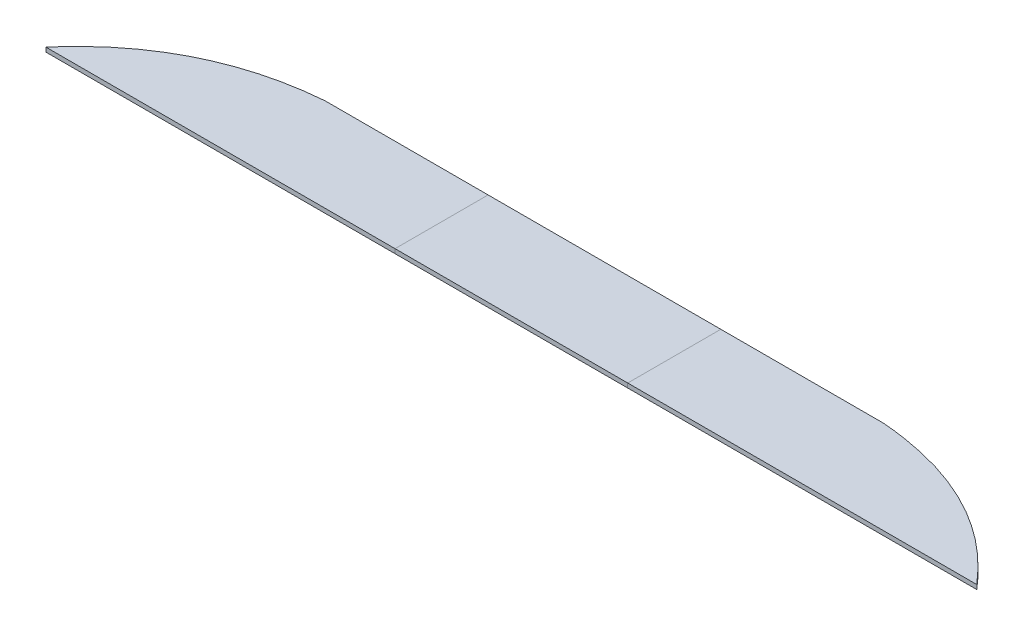
ISO-10303-21;
HEADER;
FILE_DESCRIPTION(('STEP AP214'),'2;1');
FILE_NAME('part.step','',(''),(''),'','','');
FILE_SCHEMA(('AUTOMOTIVE_DESIGN { 1 0 10303 214 1 1 1 1 }'));
ENDSEC;
DATA;
#1=APPLICATION_CONTEXT('core data for automotive mechanical design processes');
#2=APPLICATION_PROTOCOL_DEFINITION('international standard','automotive_design',2000,#1);
#3=PRODUCT_CONTEXT('',#1,'mechanical');
#4=PRODUCT('Part','Part','',(#3));
#5=PRODUCT_RELATED_PRODUCT_CATEGORY('part','',(#4));
#6=PRODUCT_DEFINITION_FORMATION('','',#4);
#7=PRODUCT_DEFINITION_CONTEXT('part definition',#1,'design');
#8=PRODUCT_DEFINITION('design','',#6,#7);
#9=PRODUCT_DEFINITION_SHAPE('','',#8);
#10=(LENGTH_UNIT() NAMED_UNIT(*) SI_UNIT(.MILLI.,.METRE.));
#11=(NAMED_UNIT(*) PLANE_ANGLE_UNIT() SI_UNIT($,.RADIAN.));
#12=(NAMED_UNIT(*) SI_UNIT($,.STERADIAN.) SOLID_ANGLE_UNIT());
#13=UNCERTAINTY_MEASURE_WITH_UNIT(LENGTH_MEASURE(1.E-05),#10,'distance_accuracy_value','');
#14=(GEOMETRIC_REPRESENTATION_CONTEXT(3) GLOBAL_UNCERTAINTY_ASSIGNED_CONTEXT((#13)) GLOBAL_UNIT_ASSIGNED_CONTEXT((#10,
#11,#12)) REPRESENTATION_CONTEXT('',''));
#15=CARTESIAN_POINT('',(0.,0.,0.));
#16=DIRECTION('',(0.,0.,1.));
#17=DIRECTION('',(1.,0.,0.));
#18=AXIS2_PLACEMENT_3D('',#15,#16,#17);
#19=CARTESIAN_POINT('',(0.,4.7625,0.));
#20=DIRECTION('',(1.,0.,0.));
#21=DIRECTION('',(0.,0.,-1.));
#22=AXIS2_PLACEMENT_3D('',#19,#20,#21);
#23=PLANE('',#22);
#24=DIRECTION('',(0.,0.,1.));
#25=VECTOR('',#24,1.);
#26=CARTESIAN_POINT('',(0.,0.,0.));
#27=LINE('',#26,#25);
#28=CARTESIAN_POINT('',(0.,0.,-101.6));
#29=VERTEX_POINT('',#28);
#30=CARTESIAN_POINT('',(0.,0.,0.));
#31=VERTEX_POINT('',#30);
#32=EDGE_CURVE('P0_E79',#29,#31,#27,.T.);
#33=ORIENTED_EDGE('',*,*,#32,.T.);
#34=DIRECTION('',(0.,-1.,0.));
#35=VECTOR('',#34,1.);
#36=CARTESIAN_POINT('',(0.,4.7625,0.));
#37=LINE('',#36,#35);
#38=CARTESIAN_POINT('',(0.,4.7625,0.));
#39=VERTEX_POINT('',#38);
#40=EDGE_CURVE('P0_E11',#39,#31,#37,.T.);
#41=ORIENTED_EDGE('',*,*,#40,.F.);
#42=DIRECTION('',(0.,0.,1.));
#43=VECTOR('',#42,1.);
#44=CARTESIAN_POINT('',(0.,4.7625,0.));
#45=LINE('',#44,#43);
#46=CARTESIAN_POINT('',(0.,4.7625,-101.6));
#47=VERTEX_POINT('',#46);
#48=EDGE_CURVE('P0_E67',#47,#39,#45,.T.);
#49=ORIENTED_EDGE('',*,*,#48,.F.);
#50=DIRECTION('',(0.,-1.,0.));
#51=VECTOR('',#50,1.);
#52=CARTESIAN_POINT('',(0.,4.7625,-101.6));
#53=LINE('',#52,#51);
#54=EDGE_CURVE('P0_E75',#47,#29,#53,.T.);
#55=ORIENTED_EDGE('',*,*,#54,.T.);
#56=EDGE_LOOP('',(#33,#41,#49,#55));
#57=FACE_BOUND('',#56,.T.);
#58=ADVANCED_FACE('P0_F16',(#57),#23,.F.);
#59=CARTESIAN_POINT('',(0.,4.7625,0.));
#60=DIRECTION('',(0.,0.,-1.));
#61=DIRECTION('',(-1.,0.,0.));
#62=AXIS2_PLACEMENT_3D('',#59,#60,#61);
#63=PLANE('',#62);
#64=DIRECTION('',(1.,0.,0.));
#65=VECTOR('',#64,1.);
#66=CARTESIAN_POINT('',(0.,0.,0.));
#67=LINE('',#66,#65);
#68=CARTESIAN_POINT('',(254.,0.,0.));
#69=VERTEX_POINT('',#68);
#70=EDGE_CURVE('P0_E71',#31,#69,#67,.T.);
#71=ORIENTED_EDGE('',*,*,#70,.T.);
#72=DIRECTION('',(0.,-1.,0.));
#73=VECTOR('',#72,1.);
#74=CARTESIAN_POINT('',(254.,4.7625,0.));
#75=LINE('',#74,#73);
#76=CARTESIAN_POINT('',(254.,4.7625,0.));
#77=VERTEX_POINT('',#76);
#78=EDGE_CURVE('P0_E24',#77,#69,#75,.T.);
#79=ORIENTED_EDGE('',*,*,#78,.F.);
#80=DIRECTION('',(1.,0.,0.));
#81=VECTOR('',#80,1.);
#82=CARTESIAN_POINT('',(0.,4.7625,0.));
#83=LINE('',#82,#81);
#84=EDGE_CURVE('P0_E62',#39,#77,#83,.T.);
#85=ORIENTED_EDGE('',*,*,#84,.F.);
#86=ORIENTED_EDGE('',*,*,#40,.T.);
#87=EDGE_LOOP('',(#71,#79,#85,#86));
#88=FACE_BOUND('',#87,.T.);
#89=ADVANCED_FACE('P0_F70',(#88),#63,.F.);
#90=CARTESIAN_POINT('',(254.,4.7625,0.));
#91=DIRECTION('',(-1.,0.,0.));
#92=DIRECTION('',(0.,0.,1.));
#93=AXIS2_PLACEMENT_3D('',#90,#91,#92);
#94=PLANE('',#93);
#95=DIRECTION('',(0.,0.,-1.));
#96=VECTOR('',#95,1.);
#97=CARTESIAN_POINT('',(254.,0.,0.));
#98=LINE('',#97,#96);
#99=CARTESIAN_POINT('',(254.,0.,-101.6));
#100=VERTEX_POINT('',#99);
#101=EDGE_CURVE('P0_E49',#69,#100,#98,.T.);
#102=ORIENTED_EDGE('',*,*,#101,.T.);
#103=DIRECTION('',(0.,-1.,0.));
#104=VECTOR('',#103,1.);
#105=CARTESIAN_POINT('',(254.,4.7625,-101.6));
#106=LINE('',#105,#104);
#107=CARTESIAN_POINT('',(254.,4.7625,-101.6));
#108=VERTEX_POINT('',#107);
#109=EDGE_CURVE('P0_E72',#108,#100,#106,.T.);
#110=ORIENTED_EDGE('',*,*,#109,.F.);
#111=DIRECTION('',(0.,0.,-1.));
#112=VECTOR('',#111,1.);
#113=CARTESIAN_POINT('',(254.,4.7625,0.));
#114=LINE('',#113,#112);
#115=EDGE_CURVE('P0_E65',#77,#108,#114,.T.);
#116=ORIENTED_EDGE('',*,*,#115,.F.);
#117=ORIENTED_EDGE('',*,*,#78,.T.);
#118=EDGE_LOOP('',(#102,#110,#116,#117));
#119=FACE_BOUND('',#118,.T.);
#120=ADVANCED_FACE('P0_F73',(#119),#94,.F.);
#121=CARTESIAN_POINT('',(0.,4.7625,-101.6));
#122=DIRECTION('',(0.,0.,1.));
#123=DIRECTION('',(1.,0.,0.));
#124=AXIS2_PLACEMENT_3D('',#121,#122,#123);
#125=PLANE('',#124);
#126=DIRECTION('',(-1.,0.,0.));
#127=VECTOR('',#126,1.);
#128=CARTESIAN_POINT('',(0.,0.,-101.6));
#129=LINE('',#128,#127);
#130=EDGE_CURVE('P0_E55',#100,#29,#129,.T.);
#131=ORIENTED_EDGE('',*,*,#130,.T.);
#132=ORIENTED_EDGE('',*,*,#54,.F.);
#133=DIRECTION('',(-1.,0.,0.));
#134=VECTOR('',#133,1.);
#135=CARTESIAN_POINT('',(0.,4.7625,-101.6));
#136=LINE('',#135,#134);
#137=EDGE_CURVE('P0_E32',#108,#47,#136,.T.);
#138=ORIENTED_EDGE('',*,*,#137,.F.);
#139=ORIENTED_EDGE('',*,*,#109,.T.);
#140=EDGE_LOOP('',(#131,#132,#138,#139));
#141=FACE_BOUND('',#140,.T.);
#142=ADVANCED_FACE('P0_F86',(#141),#125,.F.);
#143=CARTESIAN_POINT('',(0.,4.7625,0.));
#144=DIRECTION('',(0.,-1.,0.));
#145=DIRECTION('',(0.,0.,-1.));
#146=AXIS2_PLACEMENT_3D('',#143,#144,#145);
#147=PLANE('',#146);
#148=ORIENTED_EDGE('',*,*,#48,.T.);
#149=ORIENTED_EDGE('',*,*,#84,.T.);
#150=ORIENTED_EDGE('',*,*,#115,.T.);
#151=ORIENTED_EDGE('',*,*,#137,.T.);
#152=EDGE_LOOP('',(#148,#149,#150,#151));
#153=FACE_BOUND('',#152,.T.);
#154=ADVANCED_FACE('P0_F63',(#153),#147,.F.);
#155=CARTESIAN_POINT('',(0.,0.,0.));
#156=DIRECTION('',(0.,-1.,0.));
#157=DIRECTION('',(0.,0.,-1.));
#158=AXIS2_PLACEMENT_3D('',#155,#156,#157);
#159=PLANE('',#158);
#160=ORIENTED_EDGE('',*,*,#32,.F.);
#161=ORIENTED_EDGE('',*,*,#130,.F.);
#162=ORIENTED_EDGE('',*,*,#101,.F.);
#163=ORIENTED_EDGE('',*,*,#70,.F.);
#164=EDGE_LOOP('',(#160,#161,#162,#163));
#165=FACE_BOUND('',#164,.T.);
#166=ADVANCED_FACE('P0_F89',(#165),#159,.T.);
#167=CLOSED_SHELL('',(#58,#89,#120,#142,#154,#166));
#168=MANIFOLD_SOLID_BREP('P0_B1',#167);
#169=CARTESIAN_POINT('',(635.,0.,0.));
#170=DIRECTION('',(0.,0.,-1.));
#171=DIRECTION('',(1.,0.,0.));
#172=AXIS2_PLACEMENT_3D('',#169,#170,#171);
#173=PLANE('',#172);
#174=DIRECTION('',(-1.,0.,0.));
#175=VECTOR('',#174,1.);
#176=CARTESIAN_POINT('',(635.,4.7625,0.));
#177=LINE('',#176,#175);
#178=CARTESIAN_POINT('',(635.,4.7625,0.));
#179=VERTEX_POINT('',#178);
#180=CARTESIAN_POINT('',(254.,4.7625,0.));
#181=VERTEX_POINT('',#180);
#182=EDGE_CURVE('P1_E52',#179,#181,#177,.T.);
#183=ORIENTED_EDGE('',*,*,#182,.T.);
#184=DIRECTION('',(0.,1.,0.));
#185=VECTOR('',#184,1.);
#186=CARTESIAN_POINT('',(254.,0.,0.));
#187=LINE('',#186,#185);
#188=CARTESIAN_POINT('',(254.,0.,0.));
#189=VERTEX_POINT('',#188);
#190=EDGE_CURVE('P1_E24',#189,#181,#187,.T.);
#191=ORIENTED_EDGE('',*,*,#190,.F.);
#192=DIRECTION('',(-1.,0.,0.));
#193=VECTOR('',#192,1.);
#194=CARTESIAN_POINT('',(635.,0.,0.));
#195=LINE('',#194,#193);
#196=CARTESIAN_POINT('',(635.,0.,0.));
#197=VERTEX_POINT('',#196);
#198=EDGE_CURVE('P1_E71',#197,#189,#195,.T.);
#199=ORIENTED_EDGE('',*,*,#198,.F.);
#200=DIRECTION('',(0.,1.,0.));
#201=VECTOR('',#200,1.);
#202=CARTESIAN_POINT('',(635.,0.,0.));
#203=LINE('',#202,#201);
#204=EDGE_CURVE('P1_E11',#197,#179,#203,.T.);
#205=ORIENTED_EDGE('',*,*,#204,.T.);
#206=EDGE_LOOP('',(#183,#191,#199,#205));
#207=FACE_BOUND('',#206,.T.);
#208=ADVANCED_FACE('P1_F16',(#207),#173,.F.);
#209=CARTESIAN_POINT('',(254.,0.,0.));
#210=DIRECTION('',(1.,0.,0.));
#211=DIRECTION('',(0.,0.,1.));
#212=AXIS2_PLACEMENT_3D('',#209,#210,#211);
#213=PLANE('',#212);
#214=DIRECTION('',(0.,0.,-1.));
#215=VECTOR('',#214,1.);
#216=CARTESIAN_POINT('',(254.,4.7625,0.));
#217=LINE('',#216,#215);
#218=CARTESIAN_POINT('',(254.,4.7625,-101.6));
#219=VERTEX_POINT('',#218);
#220=EDGE_CURVE('P1_E76',#181,#219,#217,.T.);
#221=ORIENTED_EDGE('',*,*,#220,.T.);
#222=DIRECTION('',(0.,1.,0.));
#223=VECTOR('',#222,1.);
#224=CARTESIAN_POINT('',(254.,0.,-101.6));
#225=LINE('',#224,#223);
#226=CARTESIAN_POINT('',(254.,0.,-101.6));
#227=VERTEX_POINT('',#226);
#228=EDGE_CURVE('P1_E68',#227,#219,#225,.T.);
#229=ORIENTED_EDGE('',*,*,#228,.F.);
#230=DIRECTION('',(0.,0.,-1.));
#231=VECTOR('',#230,1.);
#232=CARTESIAN_POINT('',(254.,0.,0.));
#233=LINE('',#232,#231);
#234=EDGE_CURVE('P1_E66',#189,#227,#233,.T.);
#235=ORIENTED_EDGE('',*,*,#234,.F.);
#236=ORIENTED_EDGE('',*,*,#190,.T.);
#237=EDGE_LOOP('',(#221,#229,#235,#236));
#238=FACE_BOUND('',#237,.T.);
#239=ADVANCED_FACE('P1_F98',(#238),#213,.F.);
#240=CARTESIAN_POINT('',(635.,0.,-101.6));
#241=DIRECTION('',(0.,0.,1.));
#242=DIRECTION('',(-1.,0.,0.));
#243=AXIS2_PLACEMENT_3D('',#240,#241,#242);
#244=PLANE('',#243);
#245=DIRECTION('',(1.,0.,0.));
#246=VECTOR('',#245,1.);
#247=CARTESIAN_POINT('',(635.,4.7625,-101.6));
#248=LINE('',#247,#246);
#249=CARTESIAN_POINT('',(431.8,4.7625,-101.6));
#250=VERTEX_POINT('',#249);
#251=EDGE_CURVE('P1_E61',#219,#250,#248,.T.);
#252=ORIENTED_EDGE('',*,*,#251,.T.);
#253=DIRECTION('',(0.,-1.,0.));
#254=VECTOR('',#253,1.);
#255=CARTESIAN_POINT('',(431.8,4.7625,-101.6));
#256=LINE('',#255,#254);
#257=CARTESIAN_POINT('',(431.8,0.,-101.6));
#258=VERTEX_POINT('',#257);
#259=EDGE_CURVE('P1_E32',#250,#258,#256,.T.);
#260=ORIENTED_EDGE('',*,*,#259,.T.);
#261=DIRECTION('',(1.,0.,0.));
#262=VECTOR('',#261,1.);
#263=CARTESIAN_POINT('',(635.,0.,-101.6));
#264=LINE('',#263,#262);
#265=EDGE_CURVE('P1_E59',#227,#258,#264,.T.);
#266=ORIENTED_EDGE('',*,*,#265,.F.);
#267=ORIENTED_EDGE('',*,*,#228,.T.);
#268=EDGE_LOOP('',(#252,#260,#266,#267));
#269=FACE_BOUND('',#268,.T.);
#270=ADVANCED_FACE('P1_F57',(#269),#244,.F.);
#271=CARTESIAN_POINT('',(635.,0.,0.));
#272=DIRECTION('',(0.,1.,0.));
#273=DIRECTION('',(0.,0.,-1.));
#274=AXIS2_PLACEMENT_3D('',#271,#272,#273);
#275=PLANE('',#274);
#276=ORIENTED_EDGE('',*,*,#265,.T.);
#277=CARTESIAN_POINT('',(431.8,0.,-101.6));
#278=CARTESIAN_POINT('',(556.720652327642,0.,-91.4911518700574));
#279=CARTESIAN_POINT('',(635.,0.,0.));
#280=B_SPLINE_CURVE_WITH_KNOTS('',2,(#277,#278,#279),.UNSPECIFIED.,.F.,.F.,(3,3),(0.,1.),.UNSPECIFIED.);
#281=EDGE_CURVE('P1_E46',#197,#258,#280,.F.);
#282=ORIENTED_EDGE('',*,*,#281,.F.);
#283=ORIENTED_EDGE('',*,*,#198,.T.);
#284=ORIENTED_EDGE('',*,*,#234,.T.);
#285=EDGE_LOOP('',(#276,#282,#283,#284));
#286=FACE_BOUND('',#285,.T.);
#287=ADVANCED_FACE('P1_F64',(#286),#275,.F.);
#288=CARTESIAN_POINT('',(635.,4.7625,0.));
#289=DIRECTION('',(0.,1.,0.));
#290=DIRECTION('',(0.,0.,-1.));
#291=AXIS2_PLACEMENT_3D('',#288,#289,#290);
#292=PLANE('',#291);
#293=CARTESIAN_POINT('',(635.,4.7625,0.));
#294=CARTESIAN_POINT('',(556.720652327642,4.7625,-91.4911518700574));
#295=CARTESIAN_POINT('',(431.8,4.7625,-101.6));
#296=B_SPLINE_CURVE_WITH_KNOTS('',2,(#293,#294,#295),.UNSPECIFIED.,.F.,.F.,(3,3),(0.,1.),.UNSPECIFIED.);
#297=EDGE_CURVE('P1_E62',#179,#250,#296,.T.);
#298=ORIENTED_EDGE('',*,*,#297,.T.);
#299=ORIENTED_EDGE('',*,*,#251,.F.);
#300=ORIENTED_EDGE('',*,*,#220,.F.);
#301=ORIENTED_EDGE('',*,*,#182,.F.);
#302=EDGE_LOOP('',(#298,#299,#300,#301));
#303=FACE_BOUND('',#302,.T.);
#304=ADVANCED_FACE('P1_F92',(#303),#292,.T.);
#305=DIRECTION('',(0.,-1.,0.));
#306=VECTOR('',#305,1.);
#307=SURFACE_OF_LINEAR_EXTRUSION('',#296,#306);
#308=ORIENTED_EDGE('',*,*,#259,.F.);
#309=ORIENTED_EDGE('',*,*,#297,.F.);
#310=ORIENTED_EDGE('',*,*,#204,.F.);
#311=ORIENTED_EDGE('',*,*,#281,.T.);
#312=EDGE_LOOP('',(#308,#309,#310,#311));
#313=FACE_BOUND('',#312,.T.);
#314=ADVANCED_FACE('P1_F47',(#313),#307,.F.);
#315=CLOSED_SHELL('',(#208,#239,#270,#287,#304,#314));
#316=MANIFOLD_SOLID_BREP('P1_B1',#315);
#317=CARTESIAN_POINT('',(-381.,4.76250000000011,0.));
#318=DIRECTION('',(0.,0.,-1.));
#319=DIRECTION('',(-1.,0.,0.));
#320=AXIS2_PLACEMENT_3D('',#317,#318,#319);
#321=PLANE('',#320);
#322=DIRECTION('',(1.,0.,0.));
#323=VECTOR('',#322,1.);
#324=CARTESIAN_POINT('',(-381.,1.11022302462516E-13,0.));
#325=LINE('',#324,#323);
#326=CARTESIAN_POINT('',(-381.,1.11022302462516E-13,0.));
#327=VERTEX_POINT('',#326);
#328=CARTESIAN_POINT('',(0.,1.11022302462516E-13,0.));
#329=VERTEX_POINT('',#328);
#330=EDGE_CURVE('P2_E51',#327,#329,#325,.T.);
#331=ORIENTED_EDGE('',*,*,#330,.T.);
#332=DIRECTION('',(0.,-1.,0.));
#333=VECTOR('',#332,1.);
#334=CARTESIAN_POINT('',(0.,4.76250000000011,0.));
#335=LINE('',#334,#333);
#336=CARTESIAN_POINT('',(0.,4.76250000000011,0.));
#337=VERTEX_POINT('',#336);
#338=EDGE_CURVE('P2_E23',#337,#329,#335,.T.);
#339=ORIENTED_EDGE('',*,*,#338,.F.);
#340=DIRECTION('',(1.,0.,0.));
#341=VECTOR('',#340,1.);
#342=CARTESIAN_POINT('',(-381.,4.76250000000011,0.));
#343=LINE('',#342,#341);
#344=CARTESIAN_POINT('',(-381.,4.76250000000011,0.));
#345=VERTEX_POINT('',#344);
#346=EDGE_CURVE('P2_E70',#345,#337,#343,.T.);
#347=ORIENTED_EDGE('',*,*,#346,.F.);
#348=DIRECTION('',(0.,-1.,0.));
#349=VECTOR('',#348,1.);
#350=CARTESIAN_POINT('',(-381.,4.76250000000011,0.));
#351=LINE('',#350,#349);
#352=EDGE_CURVE('P2_E10',#345,#327,#351,.T.);
#353=ORIENTED_EDGE('',*,*,#352,.T.);
#354=EDGE_LOOP('',(#331,#339,#347,#353));
#355=FACE_BOUND('',#354,.T.);
#356=ADVANCED_FACE('P2_F15',(#355),#321,.F.);
#357=CARTESIAN_POINT('',(0.,4.76250000000011,0.));
#358=DIRECTION('',(-1.,0.,0.));
#359=DIRECTION('',(0.,0.,1.));
#360=AXIS2_PLACEMENT_3D('',#357,#358,#359);
#361=PLANE('',#360);
#362=DIRECTION('',(0.,0.,-1.));
#363=VECTOR('',#362,1.);
#364=CARTESIAN_POINT('',(0.,1.11022302462516E-13,0.));
#365=LINE('',#364,#363);
#366=CARTESIAN_POINT('',(0.,1.11022302462516E-13,-101.6));
#367=VERTEX_POINT('',#366);
#368=EDGE_CURVE('P2_E75',#329,#367,#365,.T.);
#369=ORIENTED_EDGE('',*,*,#368,.T.);
#370=DIRECTION('',(0.,-1.,0.));
#371=VECTOR('',#370,1.);
#372=CARTESIAN_POINT('',(0.,4.76250000000011,-101.6));
#373=LINE('',#372,#371);
#374=CARTESIAN_POINT('',(0.,4.76250000000011,-101.6));
#375=VERTEX_POINT('',#374);
#376=EDGE_CURVE('P2_E67',#375,#367,#373,.T.);
#377=ORIENTED_EDGE('',*,*,#376,.F.);
#378=DIRECTION('',(0.,0.,-1.));
#379=VECTOR('',#378,1.);
#380=CARTESIAN_POINT('',(0.,4.76250000000011,0.));
#381=LINE('',#380,#379);
#382=EDGE_CURVE('P2_E65',#337,#375,#381,.T.);
#383=ORIENTED_EDGE('',*,*,#382,.F.);
#384=ORIENTED_EDGE('',*,*,#338,.T.);
#385=EDGE_LOOP('',(#369,#377,#383,#384));
#386=FACE_BOUND('',#385,.T.);
#387=ADVANCED_FACE('P2_F97',(#386),#361,.F.);
#388=CARTESIAN_POINT('',(-381.,4.76250000000011,-101.6));
#389=DIRECTION('',(0.,0.,1.));
#390=DIRECTION('',(1.,0.,0.));
#391=AXIS2_PLACEMENT_3D('',#388,#389,#390);
#392=PLANE('',#391);
#393=DIRECTION('',(-1.,0.,0.));
#394=VECTOR('',#393,1.);
#395=CARTESIAN_POINT('',(-381.,1.11022302462516E-13,-101.6));
#396=LINE('',#395,#394);
#397=CARTESIAN_POINT('',(-177.8,1.11022302462516E-13,-101.6));
#398=VERTEX_POINT('',#397);
#399=EDGE_CURVE('P2_E60',#367,#398,#396,.T.);
#400=ORIENTED_EDGE('',*,*,#399,.T.);
#401=DIRECTION('',(0.,1.,0.));
#402=VECTOR('',#401,1.);
#403=CARTESIAN_POINT('',(-177.8,1.11022302462516E-13,-101.6));
#404=LINE('',#403,#402);
#405=CARTESIAN_POINT('',(-177.8,4.76250000000011,-101.6));
#406=VERTEX_POINT('',#405);
#407=EDGE_CURVE('P2_E31',#398,#406,#404,.T.);
#408=ORIENTED_EDGE('',*,*,#407,.T.);
#409=DIRECTION('',(-1.,0.,0.));
#410=VECTOR('',#409,1.);
#411=CARTESIAN_POINT('',(-381.,4.76250000000011,-101.6));
#412=LINE('',#411,#410);
#413=EDGE_CURVE('P2_E58',#375,#406,#412,.T.);
#414=ORIENTED_EDGE('',*,*,#413,.F.);
#415=ORIENTED_EDGE('',*,*,#376,.T.);
#416=EDGE_LOOP('',(#400,#408,#414,#415));
#417=FACE_BOUND('',#416,.T.);
#418=ADVANCED_FACE('P2_F56',(#417),#392,.F.);
#419=CARTESIAN_POINT('',(-381.,4.76250000000011,0.));
#420=DIRECTION('',(0.,-1.,0.));
#421=DIRECTION('',(0.,0.,-1.));
#422=AXIS2_PLACEMENT_3D('',#419,#420,#421);
#423=PLANE('',#422);
#424=ORIENTED_EDGE('',*,*,#413,.T.);
#425=CARTESIAN_POINT('',(-177.8,4.76250000000011,-101.6));
#426=CARTESIAN_POINT('',(-302.720652327642,4.76250000000011,-91.4911518700574));
#427=CARTESIAN_POINT('',(-381.,4.76250000000011,0.));
#428=B_SPLINE_CURVE_WITH_KNOTS('',2,(#425,#426,#427),.UNSPECIFIED.,.F.,.F.,(3,3),(0.,1.),.UNSPECIFIED.);
#429=EDGE_CURVE('P2_E45',#345,#406,#428,.F.);
#430=ORIENTED_EDGE('',*,*,#429,.F.);
#431=ORIENTED_EDGE('',*,*,#346,.T.);
#432=ORIENTED_EDGE('',*,*,#382,.T.);
#433=EDGE_LOOP('',(#424,#430,#431,#432));
#434=FACE_BOUND('',#433,.T.);
#435=ADVANCED_FACE('P2_F63',(#434),#423,.F.);
#436=CARTESIAN_POINT('',(-381.,1.11022302462516E-13,0.));
#437=DIRECTION('',(0.,-1.,0.));
#438=DIRECTION('',(0.,0.,-1.));
#439=AXIS2_PLACEMENT_3D('',#436,#437,#438);
#440=PLANE('',#439);
#441=CARTESIAN_POINT('',(-381.,1.11022302462516E-13,0.));
#442=CARTESIAN_POINT('',(-302.720652327642,1.11022302462516E-13,-91.4911518700574));
#443=CARTESIAN_POINT('',(-177.8,1.11022302462516E-13,-101.6));
#444=B_SPLINE_CURVE_WITH_KNOTS('',2,(#441,#442,#443),.UNSPECIFIED.,.F.,.F.,(3,3),(0.,1.),.UNSPECIFIED.);
#445=EDGE_CURVE('P2_E61',#327,#398,#444,.T.);
#446=ORIENTED_EDGE('',*,*,#445,.T.);
#447=ORIENTED_EDGE('',*,*,#399,.F.);
#448=ORIENTED_EDGE('',*,*,#368,.F.);
#449=ORIENTED_EDGE('',*,*,#330,.F.);
#450=EDGE_LOOP('',(#446,#447,#448,#449));
#451=FACE_BOUND('',#450,.T.);
#452=ADVANCED_FACE('P2_F91',(#451),#440,.T.);
#453=DIRECTION('',(0.,1.,0.));
#454=VECTOR('',#453,1.);
#455=SURFACE_OF_LINEAR_EXTRUSION('',#444,#454);
#456=ORIENTED_EDGE('',*,*,#407,.F.);
#457=ORIENTED_EDGE('',*,*,#445,.F.);
#458=ORIENTED_EDGE('',*,*,#352,.F.);
#459=ORIENTED_EDGE('',*,*,#429,.T.);
#460=EDGE_LOOP('',(#456,#457,#458,#459));
#461=FACE_BOUND('',#460,.T.);
#462=ADVANCED_FACE('P2_F46',(#461),#455,.F.);
#463=CLOSED_SHELL('',(#356,#387,#418,#435,#452,#462));
#464=MANIFOLD_SOLID_BREP('P2_B1',#463);
#465=ADVANCED_BREP_SHAPE_REPRESENTATION('',(#18,#168,#316,#464),#14);
#466=SHAPE_DEFINITION_REPRESENTATION(#9,#465);
ENDSEC;
END-ISO-10303-21;
